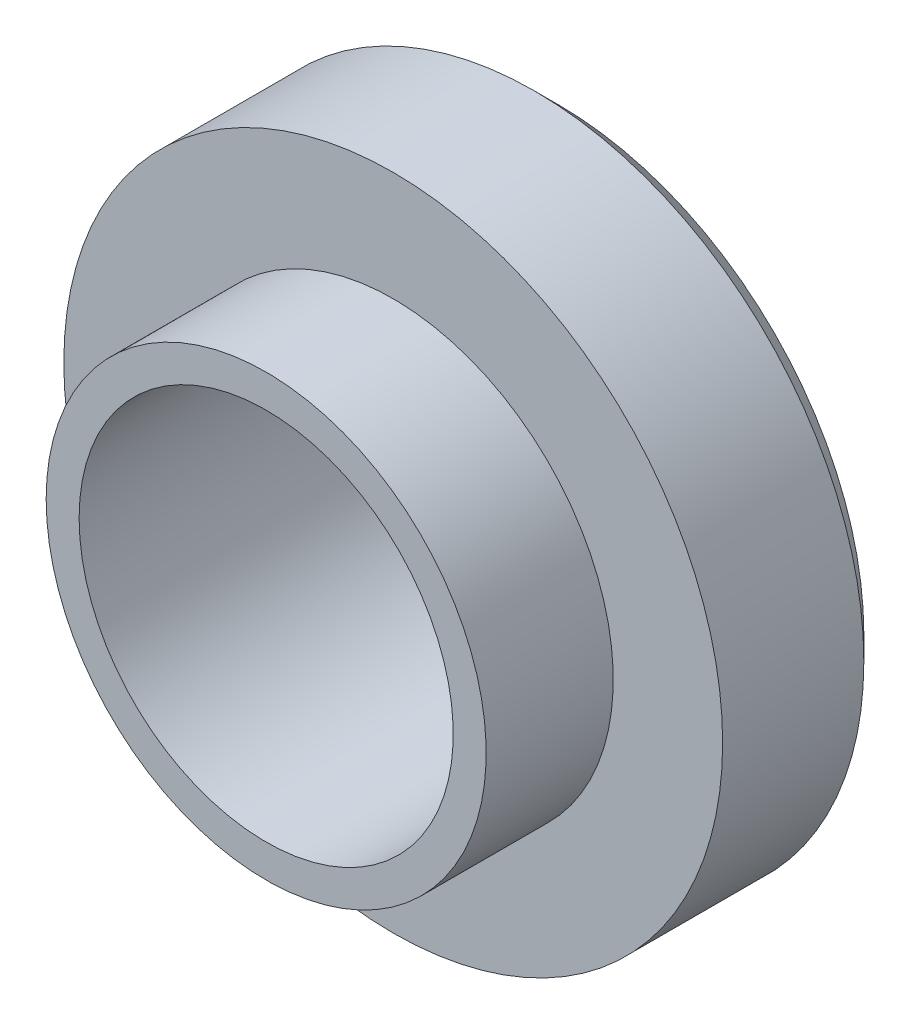
ISO-10303-21;
HEADER;
FILE_DESCRIPTION(('STEP AP214'),'2;1');
FILE_NAME('part.step','',(''),(''),'','','');
FILE_SCHEMA(('AUTOMOTIVE_DESIGN { 1 0 10303 214 1 1 1 1 }'));
ENDSEC;
DATA;
#1=APPLICATION_CONTEXT('core data for automotive mechanical design processes');
#2=APPLICATION_PROTOCOL_DEFINITION('international standard','automotive_design',2000,#1);
#3=PRODUCT_CONTEXT('',#1,'mechanical');
#4=PRODUCT('Part','Part','',(#3));
#5=PRODUCT_RELATED_PRODUCT_CATEGORY('part','',(#4));
#6=PRODUCT_DEFINITION_FORMATION('','',#4);
#7=PRODUCT_DEFINITION_CONTEXT('part definition',#1,'design');
#8=PRODUCT_DEFINITION('design','',#6,#7);
#9=PRODUCT_DEFINITION_SHAPE('','',#8);
#10=(LENGTH_UNIT() NAMED_UNIT(*) SI_UNIT(.MILLI.,.METRE.));
#11=(NAMED_UNIT(*) PLANE_ANGLE_UNIT() SI_UNIT($,.RADIAN.));
#12=(NAMED_UNIT(*) SI_UNIT($,.STERADIAN.) SOLID_ANGLE_UNIT());
#13=UNCERTAINTY_MEASURE_WITH_UNIT(LENGTH_MEASURE(1.E-05),#10,'distance_accuracy_value','');
#14=(GEOMETRIC_REPRESENTATION_CONTEXT(3) GLOBAL_UNCERTAINTY_ASSIGNED_CONTEXT((#13)) GLOBAL_UNIT_ASSIGNED_CONTEXT((#10,
#11,#12)) REPRESENTATION_CONTEXT('',''));
#15=CARTESIAN_POINT('',(0.,0.,0.));
#16=DIRECTION('',(0.,0.,1.));
#17=DIRECTION('',(1.,0.,0.));
#18=AXIS2_PLACEMENT_3D('',#15,#16,#17);
#19=CARTESIAN_POINT('',(2.96545,0.,0.));
#20=DIRECTION('',(0.,0.,1.));
#21=DIRECTION('',(1.,0.,0.));
#22=AXIS2_PLACEMENT_3D('',#19,#20,#21);
#23=PLANE('',#22);
#24=CARTESIAN_POINT('',(0.,0.,0.));
#25=DIRECTION('',(0.,0.,-1.));
#26=DIRECTION('',(-1.,0.,0.));
#27=AXIS2_PLACEMENT_3D('',#24,#25,#26);
#28=CIRCLE('',#27,2.3749);
#29=CARTESIAN_POINT('',(-2.3749,0.,0.));
#30=VERTEX_POINT('',#29);
#31=EDGE_CURVE('E37',#30,#30,#28,.F.);
#32=ORIENTED_EDGE('',*,*,#31,.F.);
#33=EDGE_LOOP('',(#32));
#34=FACE_BOUND('',#33,.T.);
#35=CARTESIAN_POINT('',(0.,0.,0.));
#36=DIRECTION('',(0.,0.,-1.));
#37=DIRECTION('',(-1.,0.,0.));
#38=AXIS2_PLACEMENT_3D('',#35,#36,#37);
#39=CIRCLE('',#38,3.556);
#40=CARTESIAN_POINT('',(-3.556,0.,0.));
#41=VERTEX_POINT('',#40);
#42=EDGE_CURVE('E17',#41,#41,#39,.T.);
#43=ORIENTED_EDGE('',*,*,#42,.F.);
#44=EDGE_LOOP('',(#43));
#45=FACE_BOUND('',#44,.T.);
#46=ADVANCED_FACE('F14',(#34,#45),#23,.T.);
#47=CARTESIAN_POINT('',(0.,0.,-4.699));
#48=DIRECTION('',(0.,0.,-1.));
#49=DIRECTION('',(-1.,0.,0.));
#50=AXIS2_PLACEMENT_3D('',#47,#48,#49);
#51=CYLINDRICAL_SURFACE('',#50,3.556);
#52=ORIENTED_EDGE('',*,*,#42,.T.);
#53=EDGE_LOOP('',(#52));
#54=FACE_BOUND('',#53,.T.);
#55=CARTESIAN_POINT('',(0.,0.,-1.52400000001762));
#56=DIRECTION('',(0.,0.,1.));
#57=DIRECTION('',(1.,0.,0.));
#58=AXIS2_PLACEMENT_3D('',#55,#56,#57);
#59=CIRCLE('',#58,3.55600000006007);
#60=CARTESIAN_POINT('',(3.55600000006007,0.,-1.52400000001762));
#61=VERTEX_POINT('',#60);
#62=EDGE_CURVE('E36',#61,#61,#59,.F.);
#63=ORIENTED_EDGE('',*,*,#62,.F.);
#64=EDGE_LOOP('',(#63));
#65=FACE_BOUND('',#64,.T.);
#66=ADVANCED_FACE('F45',(#54,#65),#51,.T.);
#67=CARTESIAN_POINT('',(0.,0.,-4.699));
#68=DIRECTION('',(0.,0.,-1.));
#69=DIRECTION('',(-1.,0.,0.));
#70=AXIS2_PLACEMENT_3D('',#67,#68,#69);
#71=CYLINDRICAL_SURFACE('',#70,2.3749);
#72=CARTESIAN_POINT('',(0.,0.,1.3716));
#73=DIRECTION('',(0.,0.,-1.));
#74=DIRECTION('',(-1.,0.,0.));
#75=AXIS2_PLACEMENT_3D('',#72,#73,#74);
#76=CIRCLE('',#75,2.3749);
#77=CARTESIAN_POINT('',(-2.3749,0.,1.3716));
#78=VERTEX_POINT('',#77);
#79=EDGE_CURVE('E34',#78,#78,#76,.F.);
#80=ORIENTED_EDGE('',*,*,#79,.F.);
#81=EDGE_LOOP('',(#80));
#82=FACE_BOUND('',#81,.T.);
#83=ORIENTED_EDGE('',*,*,#31,.T.);
#84=EDGE_LOOP('',(#83));
#85=FACE_BOUND('',#84,.T.);
#86=ADVANCED_FACE('F54',(#82,#85),#71,.T.);
#87=CARTESIAN_POINT('',(0.,0.,-1.52400000001762));
#88=DIRECTION('',(0.,0.,1.));
#89=DIRECTION('',(1.,0.,0.));
#90=AXIS2_PLACEMENT_3D('',#87,#88,#89);
#91=CONICAL_SURFACE('',#90,3.55600000006007,0.785398163397448);
#92=ORIENTED_EDGE('',*,*,#62,.T.);
#93=EDGE_LOOP('',(#92));
#94=FACE_BOUND('',#93,.T.);
#95=CARTESIAN_POINT('',(0.,0.,-1.77800000000161));
#96=DIRECTION('',(0.,0.,1.));
#97=DIRECTION('',(1.,0.,0.));
#98=AXIS2_PLACEMENT_3D('',#95,#96,#97);
#99=CIRCLE('',#98,3.30200000007608);
#100=CARTESIAN_POINT('',(3.30200000007608,0.,-1.77800000000161));
#101=VERTEX_POINT('',#100);
#102=EDGE_CURVE('E26',#101,#101,#99,.F.);
#103=ORIENTED_EDGE('',*,*,#102,.F.);
#104=EDGE_LOOP('',(#103));
#105=FACE_BOUND('',#104,.T.);
#106=ADVANCED_FACE('F69',(#94,#105),#91,.T.);
#107=CARTESIAN_POINT('',(1.18745,0.,1.3716));
#108=DIRECTION('',(0.,0.,1.));
#109=DIRECTION('',(1.,0.,0.));
#110=AXIS2_PLACEMENT_3D('',#107,#108,#109);
#111=PLANE('',#110);
#112=CARTESIAN_POINT('',(0.,0.,1.3716));
#113=DIRECTION('',(0.,0.,-1.));
#114=DIRECTION('',(-1.,0.,0.));
#115=AXIS2_PLACEMENT_3D('',#112,#113,#114);
#116=CIRCLE('',#115,2.0193);
#117=CARTESIAN_POINT('',(-2.0193,0.,1.3716));
#118=VERTEX_POINT('',#117);
#119=EDGE_CURVE('E21',#118,#118,#116,.T.);
#120=ORIENTED_EDGE('',*,*,#119,.T.);
#121=EDGE_LOOP('',(#120));
#122=FACE_BOUND('',#121,.T.);
#123=ORIENTED_EDGE('',*,*,#79,.T.);
#124=EDGE_LOOP('',(#123));
#125=FACE_BOUND('',#124,.T.);
#126=ADVANCED_FACE('F63',(#122,#125),#111,.T.);
#127=CARTESIAN_POINT('',(1.778,0.,-1.778));
#128=DIRECTION('',(0.,0.,-1.));
#129=DIRECTION('',(-1.,0.,0.));
#130=AXIS2_PLACEMENT_3D('',#127,#128,#129);
#131=PLANE('',#130);
#132=CARTESIAN_POINT('',(0.,0.,-1.778));
#133=DIRECTION('',(0.,0.,-1.));
#134=DIRECTION('',(-1.,0.,0.));
#135=AXIS2_PLACEMENT_3D('',#132,#133,#134);
#136=CIRCLE('',#135,2.0193);
#137=CARTESIAN_POINT('',(-2.0193,0.,-1.778));
#138=VERTEX_POINT('',#137);
#139=EDGE_CURVE('E10',#138,#138,#136,.F.);
#140=ORIENTED_EDGE('',*,*,#139,.T.);
#141=EDGE_LOOP('',(#140));
#142=FACE_BOUND('',#141,.T.);
#143=ORIENTED_EDGE('',*,*,#102,.T.);
#144=EDGE_LOOP('',(#143));
#145=FACE_BOUND('',#144,.T.);
#146=ADVANCED_FACE('F57',(#142,#145),#131,.T.);
#147=CARTESIAN_POINT('',(0.,0.,-9.16790037525501));
#148=DIRECTION('',(0.,0.,-1.));
#149=DIRECTION('',(-1.,0.,0.));
#150=AXIS2_PLACEMENT_3D('',#147,#148,#149);
#151=CYLINDRICAL_SURFACE('',#150,2.0193);
#152=ORIENTED_EDGE('',*,*,#139,.F.);
#153=EDGE_LOOP('',(#152));
#154=FACE_BOUND('',#153,.T.);
#155=ORIENTED_EDGE('',*,*,#119,.F.);
#156=EDGE_LOOP('',(#155));
#157=FACE_BOUND('',#156,.T.);
#158=ADVANCED_FACE('F55',(#154,#157),#151,.F.);
#159=CLOSED_SHELL('',(#46,#66,#86,#106,#126,#146,#158));
#160=MANIFOLD_SOLID_BREP('B1',#159);
#161=ADVANCED_BREP_SHAPE_REPRESENTATION('',(#18,#160),#14);
#162=SHAPE_DEFINITION_REPRESENTATION(#9,#161);
ENDSEC;
END-ISO-10303-21;
